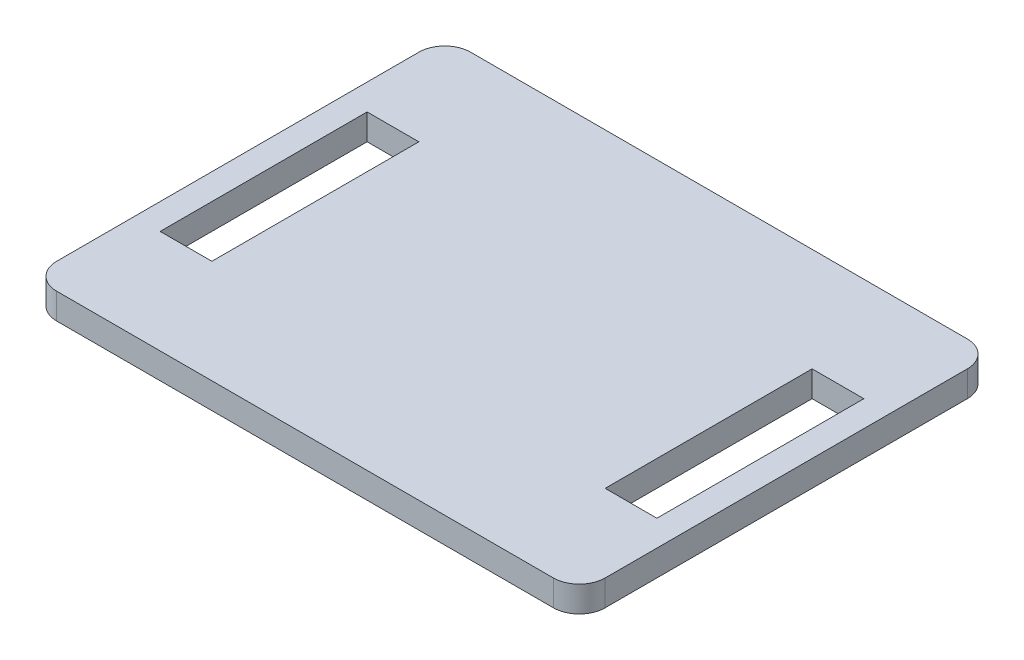
ISO-10303-21;
HEADER;
FILE_DESCRIPTION(('STEP AP214'),'2;1');
FILE_NAME('part.step','',(''),(''),'','','');
FILE_SCHEMA(('AUTOMOTIVE_DESIGN { 1 0 10303 214 1 1 1 1 }'));
ENDSEC;
DATA;
#1=APPLICATION_CONTEXT('core data for automotive mechanical design processes');
#2=APPLICATION_PROTOCOL_DEFINITION('international standard','automotive_design',2000,#1);
#3=PRODUCT_CONTEXT('',#1,'mechanical');
#4=PRODUCT('Part','Part','',(#3));
#5=PRODUCT_RELATED_PRODUCT_CATEGORY('part','',(#4));
#6=PRODUCT_DEFINITION_FORMATION('','',#4);
#7=PRODUCT_DEFINITION_CONTEXT('part definition',#1,'design');
#8=PRODUCT_DEFINITION('design','',#6,#7);
#9=PRODUCT_DEFINITION_SHAPE('','',#8);
#10=(LENGTH_UNIT() NAMED_UNIT(*) SI_UNIT(.MILLI.,.METRE.));
#11=(NAMED_UNIT(*) PLANE_ANGLE_UNIT() SI_UNIT($,.RADIAN.));
#12=(NAMED_UNIT(*) SI_UNIT($,.STERADIAN.) SOLID_ANGLE_UNIT());
#13=UNCERTAINTY_MEASURE_WITH_UNIT(LENGTH_MEASURE(1.E-05),#10,'distance_accuracy_value','');
#14=(GEOMETRIC_REPRESENTATION_CONTEXT(3) GLOBAL_UNCERTAINTY_ASSIGNED_CONTEXT((#13)) GLOBAL_UNIT_ASSIGNED_CONTEXT((#10,
#11,#12)) REPRESENTATION_CONTEXT('',''));
#15=CARTESIAN_POINT('',(0.,0.,0.));
#16=DIRECTION('',(0.,0.,1.));
#17=DIRECTION('',(1.,0.,0.));
#18=AXIS2_PLACEMENT_3D('',#15,#16,#17);
#19=CARTESIAN_POINT('',(0.,2.5,0.));
#20=DIRECTION('',(0.,-1.,0.));
#21=DIRECTION('',(0.,0.,-1.));
#22=AXIS2_PLACEMENT_3D('',#19,#20,#21);
#23=PLANE('',#22);
#24=DIRECTION('',(0.,0.,-1.));
#25=VECTOR('',#24,1.);
#26=CARTESIAN_POINT('',(-19.,2.5,10.));
#27=LINE('',#26,#25);
#28=CARTESIAN_POINT('',(-19.,2.5,10.));
#29=VERTEX_POINT('',#28);
#30=CARTESIAN_POINT('',(-19.,2.5,-10.));
#31=VERTEX_POINT('',#30);
#32=EDGE_CURVE('E210',#29,#31,#27,.T.);
#33=ORIENTED_EDGE('',*,*,#32,.F.);
#34=DIRECTION('',(1.,0.,0.));
#35=VECTOR('',#34,1.);
#36=CARTESIAN_POINT('',(-24.,2.5,10.));
#37=LINE('',#36,#35);
#38=CARTESIAN_POINT('',(-24.,2.5,10.));
#39=VERTEX_POINT('',#38);
#40=EDGE_CURVE('E221',#39,#29,#37,.T.);
#41=ORIENTED_EDGE('',*,*,#40,.F.);
#42=DIRECTION('',(0.,0.,1.));
#43=VECTOR('',#42,1.);
#44=CARTESIAN_POINT('',(-24.,2.5,10.));
#45=LINE('',#44,#43);
#46=CARTESIAN_POINT('',(-24.,2.5,-10.));
#47=VERTEX_POINT('',#46);
#48=EDGE_CURVE('E217',#47,#39,#45,.T.);
#49=ORIENTED_EDGE('',*,*,#48,.F.);
#50=DIRECTION('',(-1.,0.,0.));
#51=VECTOR('',#50,1.);
#52=CARTESIAN_POINT('',(-24.,2.5,-10.));
#53=LINE('',#52,#51);
#54=EDGE_CURVE('E213',#31,#47,#53,.T.);
#55=ORIENTED_EDGE('',*,*,#54,.F.);
#56=EDGE_LOOP('',(#33,#41,#49,#55));
#57=FACE_BOUND('',#56,.T.);
#58=DIRECTION('',(1.,0.,0.));
#59=VECTOR('',#58,1.);
#60=CARTESIAN_POINT('',(-26.5,2.5,20.));
#61=LINE('',#60,#59);
#62=CARTESIAN_POINT('',(-24.,2.5,20.));
#63=VERTEX_POINT('',#62);
#64=CARTESIAN_POINT('',(24.,2.5,20.));
#65=VERTEX_POINT('',#64);
#66=EDGE_CURVE('E264',#63,#65,#61,.T.);
#67=ORIENTED_EDGE('',*,*,#66,.T.);
#68=CARTESIAN_POINT('',(24.,2.5,17.5));
#69=DIRECTION('',(0.,-1.,0.));
#70=DIRECTION('',(0.,0.,-1.));
#71=AXIS2_PLACEMENT_3D('',#68,#69,#70);
#72=CIRCLE('',#71,2.5);
#73=CARTESIAN_POINT('',(26.5,2.5,17.5));
#74=VERTEX_POINT('',#73);
#75=EDGE_CURVE('E315',#65,#74,#72,.F.);
#76=ORIENTED_EDGE('',*,*,#75,.T.);
#77=DIRECTION('',(0.,0.,-1.));
#78=VECTOR('',#77,1.);
#79=CARTESIAN_POINT('',(26.5,2.5,20.));
#80=LINE('',#79,#78);
#81=CARTESIAN_POINT('',(26.5,2.5,-17.5));
#82=VERTEX_POINT('',#81);
#83=EDGE_CURVE('E253',#74,#82,#80,.T.);
#84=ORIENTED_EDGE('',*,*,#83,.T.);
#85=CARTESIAN_POINT('',(24.,2.5,-17.5));
#86=DIRECTION('',(0.,-1.,0.));
#87=DIRECTION('',(0.,0.,-1.));
#88=AXIS2_PLACEMENT_3D('',#85,#86,#87);
#89=CIRCLE('',#88,2.5);
#90=CARTESIAN_POINT('',(24.,2.5,-20.));
#91=VERTEX_POINT('',#90);
#92=EDGE_CURVE('E310',#82,#91,#89,.F.);
#93=ORIENTED_EDGE('',*,*,#92,.T.);
#94=DIRECTION('',(-1.,0.,0.));
#95=VECTOR('',#94,1.);
#96=CARTESIAN_POINT('',(-26.5,2.5,-20.));
#97=LINE('',#96,#95);
#98=CARTESIAN_POINT('',(-24.,2.5,-20.));
#99=VERTEX_POINT('',#98);
#100=EDGE_CURVE('E257',#91,#99,#97,.T.);
#101=ORIENTED_EDGE('',*,*,#100,.T.);
#102=CARTESIAN_POINT('',(-24.,2.5,-17.5));
#103=DIRECTION('',(0.,-1.,0.));
#104=DIRECTION('',(0.,0.,-1.));
#105=AXIS2_PLACEMENT_3D('',#102,#103,#104);
#106=CIRCLE('',#105,2.5);
#107=CARTESIAN_POINT('',(-26.5,2.5,-17.5));
#108=VERTEX_POINT('',#107);
#109=EDGE_CURVE('E64',#99,#108,#106,.F.);
#110=ORIENTED_EDGE('',*,*,#109,.T.);
#111=DIRECTION('',(0.,0.,1.));
#112=VECTOR('',#111,1.);
#113=CARTESIAN_POINT('',(-26.5,2.5,20.));
#114=LINE('',#113,#112);
#115=CARTESIAN_POINT('',(-26.5,2.5,17.5));
#116=VERTEX_POINT('',#115);
#117=EDGE_CURVE('E261',#108,#116,#114,.T.);
#118=ORIENTED_EDGE('',*,*,#117,.T.);
#119=CARTESIAN_POINT('',(-24.,2.5,17.5));
#120=DIRECTION('',(0.,-1.,0.));
#121=DIRECTION('',(0.,0.,-1.));
#122=AXIS2_PLACEMENT_3D('',#119,#120,#121);
#123=CIRCLE('',#122,2.5);
#124=EDGE_CURVE('E307',#116,#63,#123,.F.);
#125=ORIENTED_EDGE('',*,*,#124,.T.);
#126=EDGE_LOOP('',(#67,#76,#84,#93,#101,#110,#118,#125));
#127=FACE_BOUND('',#126,.T.);
#128=DIRECTION('',(0.,0.,-1.));
#129=VECTOR('',#128,1.);
#130=CARTESIAN_POINT('',(24.,2.5,9.99999999999999));
#131=LINE('',#130,#129);
#132=CARTESIAN_POINT('',(24.,2.5,9.99999999999999));
#133=VERTEX_POINT('',#132);
#134=CARTESIAN_POINT('',(24.,2.5,-10.));
#135=VERTEX_POINT('',#134);
#136=EDGE_CURVE('E157',#133,#135,#131,.T.);
#137=ORIENTED_EDGE('',*,*,#136,.F.);
#138=DIRECTION('',(1.,0.,0.));
#139=VECTOR('',#138,1.);
#140=CARTESIAN_POINT('',(24.,2.5,9.99999999999999));
#141=LINE('',#140,#139);
#142=CARTESIAN_POINT('',(19.,2.5,9.99999999999999));
#143=VERTEX_POINT('',#142);
#144=EDGE_CURVE('E186',#143,#133,#141,.T.);
#145=ORIENTED_EDGE('',*,*,#144,.F.);
#146=DIRECTION('',(0.,0.,1.));
#147=VECTOR('',#146,1.);
#148=CARTESIAN_POINT('',(19.,2.5,9.99999999999999));
#149=LINE('',#148,#147);
#150=CARTESIAN_POINT('',(19.,2.5,-10.));
#151=VERTEX_POINT('',#150);
#152=EDGE_CURVE('E182',#151,#143,#149,.T.);
#153=ORIENTED_EDGE('',*,*,#152,.F.);
#154=DIRECTION('',(-1.,0.,0.));
#155=VECTOR('',#154,1.);
#156=CARTESIAN_POINT('',(24.,2.5,-10.));
#157=LINE('',#156,#155);
#158=EDGE_CURVE('E168',#135,#151,#157,.T.);
#159=ORIENTED_EDGE('',*,*,#158,.F.);
#160=EDGE_LOOP('',(#137,#145,#153,#159));
#161=FACE_BOUND('',#160,.T.);
#162=ADVANCED_FACE('F41',(#57,#127,#161),#23,.F.);
#163=CARTESIAN_POINT('',(0.,0.,0.));
#164=DIRECTION('',(0.,-1.,0.));
#165=DIRECTION('',(0.,0.,-1.));
#166=AXIS2_PLACEMENT_3D('',#163,#164,#165);
#167=PLANE('',#166);
#168=DIRECTION('',(0.,0.,-1.));
#169=VECTOR('',#168,1.);
#170=CARTESIAN_POINT('',(26.5,0.,20.));
#171=LINE('',#170,#169);
#172=CARTESIAN_POINT('',(26.5,0.,17.5));
#173=VERTEX_POINT('',#172);
#174=CARTESIAN_POINT('',(26.5,0.,-17.5));
#175=VERTEX_POINT('',#174);
#176=EDGE_CURVE('E252',#173,#175,#171,.T.);
#177=ORIENTED_EDGE('',*,*,#176,.F.);
#178=CARTESIAN_POINT('',(24.,0.,17.5));
#179=DIRECTION('',(0.,-1.,0.));
#180=DIRECTION('',(0.,0.,-1.));
#181=AXIS2_PLACEMENT_3D('',#178,#179,#180);
#182=CIRCLE('',#181,2.5);
#183=CARTESIAN_POINT('',(24.,0.,20.));
#184=VERTEX_POINT('',#183);
#185=EDGE_CURVE('E297',#173,#184,#182,.T.);
#186=ORIENTED_EDGE('',*,*,#185,.T.);
#187=DIRECTION('',(1.,0.,0.));
#188=VECTOR('',#187,1.);
#189=CARTESIAN_POINT('',(-26.5,0.,20.));
#190=LINE('',#189,#188);
#191=CARTESIAN_POINT('',(-24.,0.,20.));
#192=VERTEX_POINT('',#191);
#193=EDGE_CURVE('E258',#192,#184,#190,.T.);
#194=ORIENTED_EDGE('',*,*,#193,.F.);
#195=CARTESIAN_POINT('',(-24.,0.,17.5));
#196=DIRECTION('',(0.,-1.,0.));
#197=DIRECTION('',(0.,0.,-1.));
#198=AXIS2_PLACEMENT_3D('',#195,#196,#197);
#199=CIRCLE('',#198,2.5);
#200=CARTESIAN_POINT('',(-26.5,0.,17.5));
#201=VERTEX_POINT('',#200);
#202=EDGE_CURVE('E288',#192,#201,#199,.T.);
#203=ORIENTED_EDGE('',*,*,#202,.T.);
#204=DIRECTION('',(0.,0.,1.));
#205=VECTOR('',#204,1.);
#206=CARTESIAN_POINT('',(-26.5,0.,20.));
#207=LINE('',#206,#205);
#208=CARTESIAN_POINT('',(-26.5,0.,-17.5));
#209=VERTEX_POINT('',#208);
#210=EDGE_CURVE('E276',#209,#201,#207,.T.);
#211=ORIENTED_EDGE('',*,*,#210,.F.);
#212=CARTESIAN_POINT('',(-24.,0.,-17.5));
#213=DIRECTION('',(0.,-1.,0.));
#214=DIRECTION('',(0.,0.,-1.));
#215=AXIS2_PLACEMENT_3D('',#212,#213,#214);
#216=CIRCLE('',#215,2.5);
#217=CARTESIAN_POINT('',(-24.,0.,-20.));
#218=VERTEX_POINT('',#217);
#219=EDGE_CURVE('E294',#209,#218,#216,.T.);
#220=ORIENTED_EDGE('',*,*,#219,.T.);
#221=DIRECTION('',(-1.,0.,0.));
#222=VECTOR('',#221,1.);
#223=CARTESIAN_POINT('',(-26.5,0.,-20.));
#224=LINE('',#223,#222);
#225=CARTESIAN_POINT('',(24.,0.,-20.));
#226=VERTEX_POINT('',#225);
#227=EDGE_CURVE('E272',#226,#218,#224,.T.);
#228=ORIENTED_EDGE('',*,*,#227,.F.);
#229=CARTESIAN_POINT('',(24.,0.,-17.5));
#230=DIRECTION('',(0.,-1.,0.));
#231=DIRECTION('',(0.,0.,-1.));
#232=AXIS2_PLACEMENT_3D('',#229,#230,#231);
#233=CIRCLE('',#232,2.5);
#234=EDGE_CURVE('E291',#226,#175,#233,.T.);
#235=ORIENTED_EDGE('',*,*,#234,.T.);
#236=EDGE_LOOP('',(#177,#186,#194,#203,#211,#220,#228,#235));
#237=FACE_BOUND('',#236,.T.);
#238=DIRECTION('',(1.,0.,0.));
#239=VECTOR('',#238,1.);
#240=CARTESIAN_POINT('',(-24.,0.,10.));
#241=LINE('',#240,#239);
#242=CARTESIAN_POINT('',(-24.,0.,10.));
#243=VERTEX_POINT('',#242);
#244=CARTESIAN_POINT('',(-19.,0.,10.));
#245=VERTEX_POINT('',#244);
#246=EDGE_CURVE('E214',#243,#245,#241,.T.);
#247=ORIENTED_EDGE('',*,*,#246,.T.);
#248=DIRECTION('',(0.,0.,-1.));
#249=VECTOR('',#248,1.);
#250=CARTESIAN_POINT('',(-19.,0.,10.));
#251=LINE('',#250,#249);
#252=CARTESIAN_POINT('',(-19.,0.,-10.));
#253=VERTEX_POINT('',#252);
#254=EDGE_CURVE('E177',#245,#253,#251,.T.);
#255=ORIENTED_EDGE('',*,*,#254,.T.);
#256=DIRECTION('',(-1.,0.,0.));
#257=VECTOR('',#256,1.);
#258=CARTESIAN_POINT('',(-24.,0.,-10.));
#259=LINE('',#258,#257);
#260=CARTESIAN_POINT('',(-24.,0.,-10.));
#261=VERTEX_POINT('',#260);
#262=EDGE_CURVE('E228',#253,#261,#259,.T.);
#263=ORIENTED_EDGE('',*,*,#262,.T.);
#264=DIRECTION('',(0.,0.,1.));
#265=VECTOR('',#264,1.);
#266=CARTESIAN_POINT('',(-24.,0.,10.));
#267=LINE('',#266,#265);
#268=EDGE_CURVE('E232',#261,#243,#267,.T.);
#269=ORIENTED_EDGE('',*,*,#268,.T.);
#270=EDGE_LOOP('',(#247,#255,#263,#269));
#271=FACE_BOUND('',#270,.T.);
#272=DIRECTION('',(1.,0.,0.));
#273=VECTOR('',#272,1.);
#274=CARTESIAN_POINT('',(24.,0.,9.99999999999999));
#275=LINE('',#274,#273);
#276=CARTESIAN_POINT('',(19.,0.,9.99999999999999));
#277=VERTEX_POINT('',#276);
#278=CARTESIAN_POINT('',(24.,0.,9.99999999999999));
#279=VERTEX_POINT('',#278);
#280=EDGE_CURVE('E169',#277,#279,#275,.T.);
#281=ORIENTED_EDGE('',*,*,#280,.T.);
#282=DIRECTION('',(0.,0.,-1.));
#283=VECTOR('',#282,1.);
#284=CARTESIAN_POINT('',(24.,0.,9.99999999999999));
#285=LINE('',#284,#283);
#286=CARTESIAN_POINT('',(24.,0.,-10.));
#287=VERTEX_POINT('',#286);
#288=EDGE_CURVE('E191',#279,#287,#285,.T.);
#289=ORIENTED_EDGE('',*,*,#288,.T.);
#290=DIRECTION('',(-1.,0.,0.));
#291=VECTOR('',#290,1.);
#292=CARTESIAN_POINT('',(24.,0.,-10.));
#293=LINE('',#292,#291);
#294=CARTESIAN_POINT('',(19.,0.,-10.));
#295=VERTEX_POINT('',#294);
#296=EDGE_CURVE('E175',#287,#295,#293,.T.);
#297=ORIENTED_EDGE('',*,*,#296,.T.);
#298=DIRECTION('',(0.,0.,1.));
#299=VECTOR('',#298,1.);
#300=CARTESIAN_POINT('',(19.,0.,9.99999999999999));
#301=LINE('',#300,#299);
#302=EDGE_CURVE('E196',#295,#277,#301,.T.);
#303=ORIENTED_EDGE('',*,*,#302,.T.);
#304=EDGE_LOOP('',(#281,#289,#297,#303));
#305=FACE_BOUND('',#304,.T.);
#306=ADVANCED_FACE('F335',(#237,#271,#305),#167,.T.);
#307=CARTESIAN_POINT('',(26.5,2.5,20.));
#308=DIRECTION('',(-1.,0.,0.));
#309=DIRECTION('',(0.,0.,1.));
#310=AXIS2_PLACEMENT_3D('',#307,#308,#309);
#311=PLANE('',#310);
#312=ORIENTED_EDGE('',*,*,#83,.F.);
#313=DIRECTION('',(0.,-1.,0.));
#314=VECTOR('',#313,1.);
#315=CARTESIAN_POINT('',(26.5,2.5,17.5));
#316=LINE('',#315,#314);
#317=EDGE_CURVE('E284',#74,#173,#316,.T.);
#318=ORIENTED_EDGE('',*,*,#317,.T.);
#319=ORIENTED_EDGE('',*,*,#176,.T.);
#320=DIRECTION('',(0.,-1.,0.));
#321=VECTOR('',#320,1.);
#322=CARTESIAN_POINT('',(26.5,2.5,-17.5));
#323=LINE('',#322,#321);
#324=EDGE_CURVE('E268',#175,#82,#323,.F.);
#325=ORIENTED_EDGE('',*,*,#324,.T.);
#326=EDGE_LOOP('',(#312,#318,#319,#325));
#327=FACE_BOUND('',#326,.T.);
#328=ADVANCED_FACE('F356',(#327),#311,.F.);
#329=CARTESIAN_POINT('',(-26.5,2.5,-20.));
#330=DIRECTION('',(0.,0.,1.));
#331=DIRECTION('',(1.,0.,0.));
#332=AXIS2_PLACEMENT_3D('',#329,#330,#331);
#333=PLANE('',#332);
#334=ORIENTED_EDGE('',*,*,#227,.T.);
#335=DIRECTION('',(0.,-1.,0.));
#336=VECTOR('',#335,1.);
#337=CARTESIAN_POINT('',(-24.,2.5,-20.));
#338=LINE('',#337,#336);
#339=EDGE_CURVE('E11',#218,#99,#338,.F.);
#340=ORIENTED_EDGE('',*,*,#339,.T.);
#341=ORIENTED_EDGE('',*,*,#100,.F.);
#342=DIRECTION('',(0.,-1.,0.));
#343=VECTOR('',#342,1.);
#344=CARTESIAN_POINT('',(24.,2.5,-20.));
#345=LINE('',#344,#343);
#346=EDGE_CURVE('E50',#91,#226,#345,.T.);
#347=ORIENTED_EDGE('',*,*,#346,.T.);
#348=EDGE_LOOP('',(#334,#340,#341,#347));
#349=FACE_BOUND('',#348,.T.);
#350=ADVANCED_FACE('F329',(#349),#333,.F.);
#351=CARTESIAN_POINT('',(-26.5,2.5,20.));
#352=DIRECTION('',(1.,0.,0.));
#353=DIRECTION('',(0.,0.,-1.));
#354=AXIS2_PLACEMENT_3D('',#351,#352,#353);
#355=PLANE('',#354);
#356=ORIENTED_EDGE('',*,*,#117,.F.);
#357=DIRECTION('',(0.,-1.,0.));
#358=VECTOR('',#357,1.);
#359=CARTESIAN_POINT('',(-26.5,2.5,-17.5));
#360=LINE('',#359,#358);
#361=EDGE_CURVE('E320',#108,#209,#360,.T.);
#362=ORIENTED_EDGE('',*,*,#361,.T.);
#363=ORIENTED_EDGE('',*,*,#210,.T.);
#364=DIRECTION('',(0.,-1.,0.));
#365=VECTOR('',#364,1.);
#366=CARTESIAN_POINT('',(-26.5,2.5,17.5));
#367=LINE('',#366,#365);
#368=EDGE_CURVE('E57',#201,#116,#367,.F.);
#369=ORIENTED_EDGE('',*,*,#368,.T.);
#370=EDGE_LOOP('',(#356,#362,#363,#369));
#371=FACE_BOUND('',#370,.T.);
#372=ADVANCED_FACE('F341',(#371),#355,.F.);
#373=CARTESIAN_POINT('',(-26.5,2.5,20.));
#374=DIRECTION('',(0.,0.,-1.));
#375=DIRECTION('',(-1.,0.,0.));
#376=AXIS2_PLACEMENT_3D('',#373,#374,#375);
#377=PLANE('',#376);
#378=ORIENTED_EDGE('',*,*,#193,.T.);
#379=DIRECTION('',(0.,-1.,0.));
#380=VECTOR('',#379,1.);
#381=CARTESIAN_POINT('',(24.,2.5,20.));
#382=LINE('',#381,#380);
#383=EDGE_CURVE('E304',#184,#65,#382,.F.);
#384=ORIENTED_EDGE('',*,*,#383,.T.);
#385=ORIENTED_EDGE('',*,*,#66,.F.);
#386=DIRECTION('',(0.,-1.,0.));
#387=VECTOR('',#386,1.);
#388=CARTESIAN_POINT('',(-24.,2.5,20.));
#389=LINE('',#388,#387);
#390=EDGE_CURVE('E300',#63,#192,#389,.T.);
#391=ORIENTED_EDGE('',*,*,#390,.T.);
#392=EDGE_LOOP('',(#378,#384,#385,#391));
#393=FACE_BOUND('',#392,.T.);
#394=ADVANCED_FACE('F348',(#393),#377,.F.);
#395=CARTESIAN_POINT('',(-19.,2.5,10.));
#396=DIRECTION('',(-1.,0.,0.));
#397=DIRECTION('',(0.,0.,1.));
#398=AXIS2_PLACEMENT_3D('',#395,#396,#397);
#399=PLANE('',#398);
#400=ORIENTED_EDGE('',*,*,#254,.F.);
#401=DIRECTION('',(0.,-1.,0.));
#402=VECTOR('',#401,1.);
#403=CARTESIAN_POINT('',(-19.,2.5,10.));
#404=LINE('',#403,#402);
#405=EDGE_CURVE('E224',#29,#245,#404,.T.);
#406=ORIENTED_EDGE('',*,*,#405,.F.);
#407=ORIENTED_EDGE('',*,*,#32,.T.);
#408=DIRECTION('',(0.,-1.,0.));
#409=VECTOR('',#408,1.);
#410=CARTESIAN_POINT('',(-19.,2.5,-10.));
#411=LINE('',#410,#409);
#412=EDGE_CURVE('E248',#31,#253,#411,.T.);
#413=ORIENTED_EDGE('',*,*,#412,.T.);
#414=EDGE_LOOP('',(#400,#406,#407,#413));
#415=FACE_BOUND('',#414,.T.);
#416=ADVANCED_FACE('F374',(#415),#399,.T.);
#417=CARTESIAN_POINT('',(-24.,2.5,-10.));
#418=DIRECTION('',(0.,0.,1.));
#419=DIRECTION('',(1.,0.,0.));
#420=AXIS2_PLACEMENT_3D('',#417,#418,#419);
#421=PLANE('',#420);
#422=ORIENTED_EDGE('',*,*,#262,.F.);
#423=ORIENTED_EDGE('',*,*,#412,.F.);
#424=ORIENTED_EDGE('',*,*,#54,.T.);
#425=DIRECTION('',(0.,-1.,0.));
#426=VECTOR('',#425,1.);
#427=CARTESIAN_POINT('',(-24.,2.5,-10.));
#428=LINE('',#427,#426);
#429=EDGE_CURVE('E245',#47,#261,#428,.T.);
#430=ORIENTED_EDGE('',*,*,#429,.T.);
#431=EDGE_LOOP('',(#422,#423,#424,#430));
#432=FACE_BOUND('',#431,.T.);
#433=ADVANCED_FACE('F410',(#432),#421,.T.);
#434=CARTESIAN_POINT('',(-24.,2.5,10.));
#435=DIRECTION('',(1.,0.,0.));
#436=DIRECTION('',(0.,0.,-1.));
#437=AXIS2_PLACEMENT_3D('',#434,#435,#436);
#438=PLANE('',#437);
#439=ORIENTED_EDGE('',*,*,#268,.F.);
#440=ORIENTED_EDGE('',*,*,#429,.F.);
#441=ORIENTED_EDGE('',*,*,#48,.T.);
#442=DIRECTION('',(0.,-1.,0.));
#443=VECTOR('',#442,1.);
#444=CARTESIAN_POINT('',(-24.,2.5,10.));
#445=LINE('',#444,#443);
#446=EDGE_CURVE('E242',#39,#243,#445,.T.);
#447=ORIENTED_EDGE('',*,*,#446,.T.);
#448=EDGE_LOOP('',(#439,#440,#441,#447));
#449=FACE_BOUND('',#448,.T.);
#450=ADVANCED_FACE('F407',(#449),#438,.T.);
#451=CARTESIAN_POINT('',(-24.,2.5,10.));
#452=DIRECTION('',(0.,0.,-1.));
#453=DIRECTION('',(-1.,0.,0.));
#454=AXIS2_PLACEMENT_3D('',#451,#452,#453);
#455=PLANE('',#454);
#456=ORIENTED_EDGE('',*,*,#246,.F.);
#457=ORIENTED_EDGE('',*,*,#446,.F.);
#458=ORIENTED_EDGE('',*,*,#40,.T.);
#459=ORIENTED_EDGE('',*,*,#405,.T.);
#460=EDGE_LOOP('',(#456,#457,#458,#459));
#461=FACE_BOUND('',#460,.T.);
#462=ADVANCED_FACE('F404',(#461),#455,.T.);
#463=CARTESIAN_POINT('',(24.,2.5,9.99999999999999));
#464=DIRECTION('',(-1.,0.,0.));
#465=DIRECTION('',(0.,0.,1.));
#466=AXIS2_PLACEMENT_3D('',#463,#464,#465);
#467=PLANE('',#466);
#468=ORIENTED_EDGE('',*,*,#288,.F.);
#469=DIRECTION('',(0.,-1.,0.));
#470=VECTOR('',#469,1.);
#471=CARTESIAN_POINT('',(24.,2.5,9.99999999999999));
#472=LINE('',#471,#470);
#473=EDGE_CURVE('E163',#133,#279,#472,.T.);
#474=ORIENTED_EDGE('',*,*,#473,.F.);
#475=ORIENTED_EDGE('',*,*,#136,.T.);
#476=DIRECTION('',(0.,-1.,0.));
#477=VECTOR('',#476,1.);
#478=CARTESIAN_POINT('',(24.,2.5,-10.));
#479=LINE('',#478,#477);
#480=EDGE_CURVE('E160',#135,#287,#479,.T.);
#481=ORIENTED_EDGE('',*,*,#480,.T.);
#482=EDGE_LOOP('',(#468,#474,#475,#481));
#483=FACE_BOUND('',#482,.T.);
#484=ADVANCED_FACE('F159',(#483),#467,.T.);
#485=CARTESIAN_POINT('',(24.,2.5,-10.));
#486=DIRECTION('',(0.,0.,1.));
#487=DIRECTION('',(1.,0.,0.));
#488=AXIS2_PLACEMENT_3D('',#485,#486,#487);
#489=PLANE('',#488);
#490=ORIENTED_EDGE('',*,*,#296,.F.);
#491=ORIENTED_EDGE('',*,*,#480,.F.);
#492=ORIENTED_EDGE('',*,*,#158,.T.);
#493=DIRECTION('',(0.,-1.,0.));
#494=VECTOR('',#493,1.);
#495=CARTESIAN_POINT('',(19.,2.5,-10.));
#496=LINE('',#495,#494);
#497=EDGE_CURVE('E178',#151,#295,#496,.T.);
#498=ORIENTED_EDGE('',*,*,#497,.T.);
#499=EDGE_LOOP('',(#490,#491,#492,#498));
#500=FACE_BOUND('',#499,.T.);
#501=ADVANCED_FACE('F172',(#500),#489,.T.);
#502=CARTESIAN_POINT('',(19.,2.5,9.99999999999999));
#503=DIRECTION('',(1.,0.,0.));
#504=DIRECTION('',(0.,0.,-1.));
#505=AXIS2_PLACEMENT_3D('',#502,#503,#504);
#506=PLANE('',#505);
#507=ORIENTED_EDGE('',*,*,#302,.F.);
#508=ORIENTED_EDGE('',*,*,#497,.F.);
#509=ORIENTED_EDGE('',*,*,#152,.T.);
#510=DIRECTION('',(0.,-1.,0.));
#511=VECTOR('',#510,1.);
#512=CARTESIAN_POINT('',(19.,2.5,9.99999999999999));
#513=LINE('',#512,#511);
#514=EDGE_CURVE('E205',#143,#277,#513,.T.);
#515=ORIENTED_EDGE('',*,*,#514,.T.);
#516=EDGE_LOOP('',(#507,#508,#509,#515));
#517=FACE_BOUND('',#516,.T.);
#518=ADVANCED_FACE('F390',(#517),#506,.T.);
#519=CARTESIAN_POINT('',(24.,2.5,9.99999999999999));
#520=DIRECTION('',(0.,0.,-1.));
#521=DIRECTION('',(-1.,0.,0.));
#522=AXIS2_PLACEMENT_3D('',#519,#520,#521);
#523=PLANE('',#522);
#524=ORIENTED_EDGE('',*,*,#280,.F.);
#525=ORIENTED_EDGE('',*,*,#514,.F.);
#526=ORIENTED_EDGE('',*,*,#144,.T.);
#527=ORIENTED_EDGE('',*,*,#473,.T.);
#528=EDGE_LOOP('',(#524,#525,#526,#527));
#529=FACE_BOUND('',#528,.T.);
#530=ADVANCED_FACE('F386',(#529),#523,.T.);
#531=CARTESIAN_POINT('',(24.,2.5,17.5));
#532=DIRECTION('',(0.,-1.,0.));
#533=DIRECTION('',(0.,0.,-1.));
#534=AXIS2_PLACEMENT_3D('',#531,#532,#533);
#535=CYLINDRICAL_SURFACE('',#534,2.5);
#536=ORIENTED_EDGE('',*,*,#75,.F.);
#537=ORIENTED_EDGE('',*,*,#383,.F.);
#538=ORIENTED_EDGE('',*,*,#185,.F.);
#539=ORIENTED_EDGE('',*,*,#317,.F.);
#540=EDGE_LOOP('',(#536,#537,#538,#539));
#541=FACE_BOUND('',#540,.T.);
#542=ADVANCED_FACE('F353',(#541),#535,.T.);
#543=CARTESIAN_POINT('',(-24.,2.5,-17.5));
#544=DIRECTION('',(0.,-1.,0.));
#545=DIRECTION('',(0.,0.,-1.));
#546=AXIS2_PLACEMENT_3D('',#543,#544,#545);
#547=CYLINDRICAL_SURFACE('',#546,2.5);
#548=ORIENTED_EDGE('',*,*,#109,.F.);
#549=ORIENTED_EDGE('',*,*,#339,.F.);
#550=ORIENTED_EDGE('',*,*,#219,.F.);
#551=ORIENTED_EDGE('',*,*,#361,.F.);
#552=EDGE_LOOP('',(#548,#549,#550,#551));
#553=FACE_BOUND('',#552,.T.);
#554=ADVANCED_FACE('F340',(#553),#547,.T.);
#555=CARTESIAN_POINT('',(24.,2.5,-17.5));
#556=DIRECTION('',(0.,-1.,0.));
#557=DIRECTION('',(0.,0.,-1.));
#558=AXIS2_PLACEMENT_3D('',#555,#556,#557);
#559=CYLINDRICAL_SURFACE('',#558,2.5);
#560=ORIENTED_EDGE('',*,*,#92,.F.);
#561=ORIENTED_EDGE('',*,*,#324,.F.);
#562=ORIENTED_EDGE('',*,*,#234,.F.);
#563=ORIENTED_EDGE('',*,*,#346,.F.);
#564=EDGE_LOOP('',(#560,#561,#562,#563));
#565=FACE_BOUND('',#564,.T.);
#566=ADVANCED_FACE('F358',(#565),#559,.T.);
#567=CARTESIAN_POINT('',(-24.,2.5,17.5));
#568=DIRECTION('',(0.,-1.,0.));
#569=DIRECTION('',(0.,0.,-1.));
#570=AXIS2_PLACEMENT_3D('',#567,#568,#569);
#571=CYLINDRICAL_SURFACE('',#570,2.5);
#572=ORIENTED_EDGE('',*,*,#124,.F.);
#573=ORIENTED_EDGE('',*,*,#368,.F.);
#574=ORIENTED_EDGE('',*,*,#202,.F.);
#575=ORIENTED_EDGE('',*,*,#390,.F.);
#576=EDGE_LOOP('',(#572,#573,#574,#575));
#577=FACE_BOUND('',#576,.T.);
#578=ADVANCED_FACE('F43',(#577),#571,.T.);
#579=CLOSED_SHELL('',(#162,#306,#328,#350,#372,#394,#416,#433,#450,#462,#484,#501,#518,#530,
#542,#554,#566,#578));
#580=MANIFOLD_SOLID_BREP('B2',#579);
#581=ADVANCED_BREP_SHAPE_REPRESENTATION('',(#18,#580),#14);
#582=SHAPE_DEFINITION_REPRESENTATION(#9,#581);
ENDSEC;
END-ISO-10303-21;
